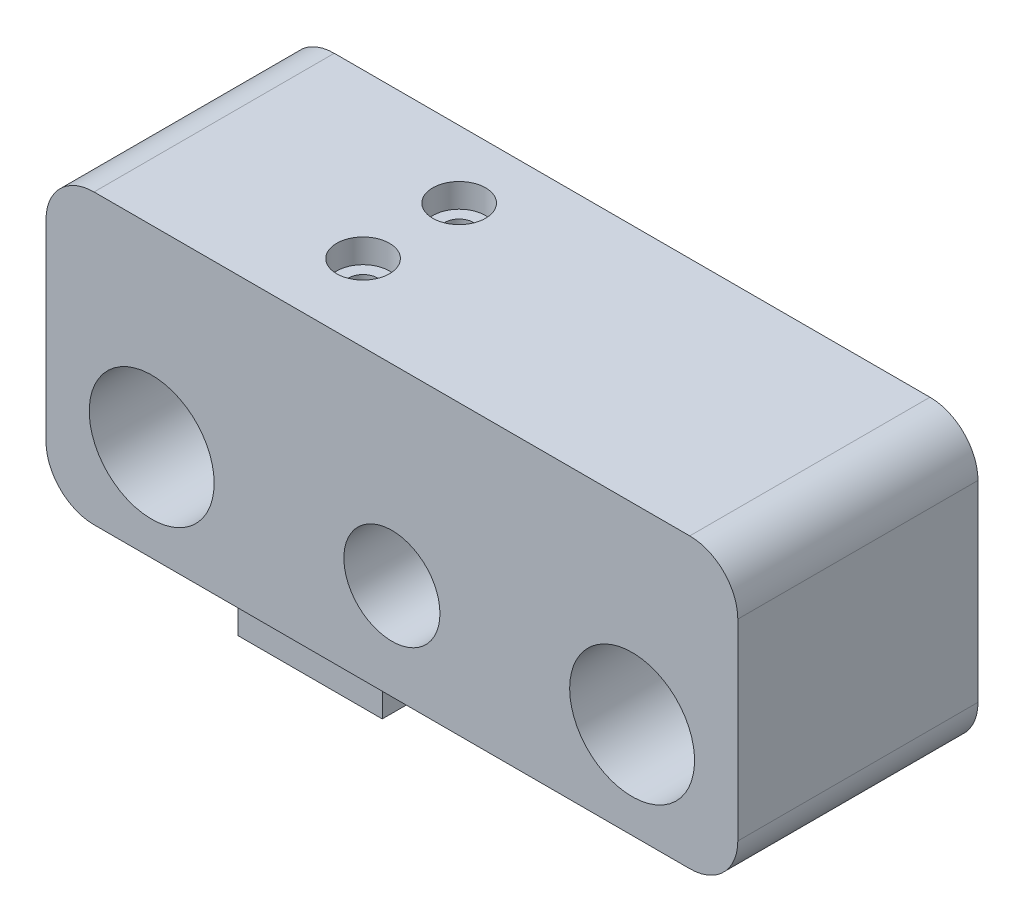
ISO-10303-21;
HEADER;
FILE_DESCRIPTION(('STEP AP214'),'2;1');
FILE_NAME('part.step','',(''),(''),'','','');
FILE_SCHEMA(('AUTOMOTIVE_DESIGN { 1 0 10303 214 1 1 1 1 }'));
ENDSEC;
DATA;
#1=APPLICATION_CONTEXT('core data for automotive mechanical design processes');
#2=APPLICATION_PROTOCOL_DEFINITION('international standard','automotive_design',2000,#1);
#3=PRODUCT_CONTEXT('',#1,'mechanical');
#4=PRODUCT('Part','Part','',(#3));
#5=PRODUCT_RELATED_PRODUCT_CATEGORY('part','',(#4));
#6=PRODUCT_DEFINITION_FORMATION('','',#4);
#7=PRODUCT_DEFINITION_CONTEXT('part definition',#1,'design');
#8=PRODUCT_DEFINITION('design','',#6,#7);
#9=PRODUCT_DEFINITION_SHAPE('','',#8);
#10=(LENGTH_UNIT() NAMED_UNIT(*) SI_UNIT(.MILLI.,.METRE.));
#11=(NAMED_UNIT(*) PLANE_ANGLE_UNIT() SI_UNIT($,.RADIAN.));
#12=(NAMED_UNIT(*) SI_UNIT($,.STERADIAN.) SOLID_ANGLE_UNIT());
#13=UNCERTAINTY_MEASURE_WITH_UNIT(LENGTH_MEASURE(1.E-05),#10,'distance_accuracy_value','');
#14=(GEOMETRIC_REPRESENTATION_CONTEXT(3) GLOBAL_UNCERTAINTY_ASSIGNED_CONTEXT((#13)) GLOBAL_UNIT_ASSIGNED_CONTEXT((#10,
#11,#12)) REPRESENTATION_CONTEXT('',''));
#15=CARTESIAN_POINT('',(0.,0.,0.));
#16=DIRECTION('',(0.,0.,1.));
#17=DIRECTION('',(1.,0.,0.));
#18=AXIS2_PLACEMENT_3D('',#15,#16,#17);
#19=CARTESIAN_POINT('',(-72.,-20.,-0.001000000000001));
#20=DIRECTION('',(0.,1.,0.));
#21=DIRECTION('',(0.,0.,1.));
#22=AXIS2_PLACEMENT_3D('',#19,#20,#21);
#23=PLANE('',#22);
#24=DIRECTION('',(-1.,0.,0.));
#25=VECTOR('',#24,1.);
#26=CARTESIAN_POINT('',(-72.,-20.,50.));
#27=LINE('',#26,#25);
#28=CARTESIAN_POINT('',(62.,-20.,50.));
#29=VERTEX_POINT('',#28);
#30=CARTESIAN_POINT('',(-62.,-20.,50.));
#31=VERTEX_POINT('',#30);
#32=EDGE_CURVE('E165',#29,#31,#27,.T.);
#33=ORIENTED_EDGE('',*,*,#32,.T.);
#34=DIRECTION('',(0.,0.,1.));
#35=VECTOR('',#34,1.);
#36=CARTESIAN_POINT('',(-62.,-20.,-0.001000000000001));
#37=LINE('',#36,#35);
#38=CARTESIAN_POINT('',(-62.,-20.,0.));
#39=VERTEX_POINT('',#38);
#40=EDGE_CURVE('E237',#31,#39,#37,.F.);
#41=ORIENTED_EDGE('',*,*,#40,.T.);
#42=DIRECTION('',(-1.,0.,0.));
#43=VECTOR('',#42,1.);
#44=CARTESIAN_POINT('',(-72.,-20.,0.));
#45=LINE('',#44,#43);
#46=CARTESIAN_POINT('',(62.,-20.,0.));
#47=VERTEX_POINT('',#46);
#48=EDGE_CURVE('E162',#47,#39,#45,.T.);
#49=ORIENTED_EDGE('',*,*,#48,.F.);
#50=DIRECTION('',(0.,0.,1.));
#51=VECTOR('',#50,1.);
#52=CARTESIAN_POINT('',(62.,-20.,-0.001000000000001));
#53=LINE('',#52,#51);
#54=EDGE_CURVE('E197',#47,#29,#53,.T.);
#55=ORIENTED_EDGE('',*,*,#54,.T.);
#56=EDGE_LOOP('',(#33,#41,#49,#55));
#57=FACE_BOUND('',#56,.T.);
#58=DIRECTION('',(0.,0.,-1.));
#59=VECTOR('',#58,1.);
#60=CARTESIAN_POINT('',(-37.,-20.,4.99999999999998));
#61=LINE('',#60,#59);
#62=CARTESIAN_POINT('',(-37.,-20.,45.));
#63=VERTEX_POINT('',#62);
#64=CARTESIAN_POINT('',(-37.,-20.,4.99999999999998));
#65=VERTEX_POINT('',#64);
#66=EDGE_CURVE('E143',#63,#65,#61,.T.);
#67=ORIENTED_EDGE('',*,*,#66,.F.);
#68=DIRECTION('',(-1.,0.,0.));
#69=VECTOR('',#68,1.);
#70=CARTESIAN_POINT('',(-6.99999999999998,-20.,45.));
#71=LINE('',#70,#69);
#72=CARTESIAN_POINT('',(-6.99999999999998,-20.,45.));
#73=VERTEX_POINT('',#72);
#74=EDGE_CURVE('E140',#73,#63,#71,.T.);
#75=ORIENTED_EDGE('',*,*,#74,.F.);
#76=DIRECTION('',(0.,0.,1.));
#77=VECTOR('',#76,1.);
#78=CARTESIAN_POINT('',(-6.99999999999998,-20.,4.99999999999998));
#79=LINE('',#78,#77);
#80=CARTESIAN_POINT('',(-6.99999999999998,-20.,4.99999999999998));
#81=VERTEX_POINT('',#80);
#82=EDGE_CURVE('E55',#81,#73,#79,.T.);
#83=ORIENTED_EDGE('',*,*,#82,.F.);
#84=DIRECTION('',(1.,0.,0.));
#85=VECTOR('',#84,1.);
#86=CARTESIAN_POINT('',(-6.99999999999998,-20.,4.99999999999998));
#87=LINE('',#86,#85);
#88=EDGE_CURVE('E50',#65,#81,#87,.T.);
#89=ORIENTED_EDGE('',*,*,#88,.F.);
#90=EDGE_LOOP('',(#67,#75,#83,#89));
#91=FACE_BOUND('',#90,.T.);
#92=ADVANCED_FACE('F33',(#57,#91),#23,.F.);
#93=CARTESIAN_POINT('',(-22.,80.,14.));
#94=DIRECTION('',(0.,-1.,0.));
#95=DIRECTION('',(0.,0.,-1.));
#96=AXIS2_PLACEMENT_3D('',#93,#94,#95);
#97=CYLINDRICAL_SURFACE('',#96,3.);
#98=CARTESIAN_POINT('',(-22.,35.,14.));
#99=DIRECTION('',(0.,1.,0.));
#100=DIRECTION('',(0.,0.,1.));
#101=AXIS2_PLACEMENT_3D('',#98,#99,#100);
#102=CIRCLE('',#101,3.);
#103=CARTESIAN_POINT('',(-22.,35.,17.));
#104=VERTEX_POINT('',#103);
#105=EDGE_CURVE('E37',#104,#104,#102,.F.);
#106=ORIENTED_EDGE('',*,*,#105,.F.);
#107=EDGE_LOOP('',(#106));
#108=FACE_BOUND('',#107,.T.);
#109=CARTESIAN_POINT('',(-22.,-30.,14.));
#110=DIRECTION('',(0.,-1.,0.));
#111=DIRECTION('',(0.,0.,-1.));
#112=AXIS2_PLACEMENT_3D('',#109,#110,#111);
#113=CIRCLE('',#112,3.);
#114=CARTESIAN_POINT('',(-22.,-30.,11.));
#115=VERTEX_POINT('',#114);
#116=EDGE_CURVE('E255',#115,#115,#113,.F.);
#117=ORIENTED_EDGE('',*,*,#116,.F.);
#118=EDGE_LOOP('',(#117));
#119=FACE_BOUND('',#118,.T.);
#120=ADVANCED_FACE('F248',(#108,#119),#97,.F.);
#121=CARTESIAN_POINT('',(-22.,80.,34.));
#122=DIRECTION('',(0.,-1.,0.));
#123=DIRECTION('',(0.,0.,-1.));
#124=AXIS2_PLACEMENT_3D('',#121,#122,#123);
#125=CYLINDRICAL_SURFACE('',#124,3.);
#126=CARTESIAN_POINT('',(-22.,35.,34.));
#127=DIRECTION('',(0.,1.,0.));
#128=DIRECTION('',(0.,0.,1.));
#129=AXIS2_PLACEMENT_3D('',#126,#127,#128);
#130=CIRCLE('',#129,3.);
#131=CARTESIAN_POINT('',(-22.,35.,37.));
#132=VERTEX_POINT('',#131);
#133=EDGE_CURVE('E156',#132,#132,#130,.F.);
#134=ORIENTED_EDGE('',*,*,#133,.F.);
#135=EDGE_LOOP('',(#134));
#136=FACE_BOUND('',#135,.T.);
#137=CARTESIAN_POINT('',(-22.,-30.,34.));
#138=DIRECTION('',(0.,-1.,0.));
#139=DIRECTION('',(0.,0.,-1.));
#140=AXIS2_PLACEMENT_3D('',#137,#138,#139);
#141=CIRCLE('',#140,3.);
#142=CARTESIAN_POINT('',(-22.,-30.,31.));
#143=VERTEX_POINT('',#142);
#144=EDGE_CURVE('E257',#143,#143,#141,.F.);
#145=ORIENTED_EDGE('',*,*,#144,.F.);
#146=EDGE_LOOP('',(#145));
#147=FACE_BOUND('',#146,.T.);
#148=ADVANCED_FACE('F251',(#136,#147),#125,.F.);
#149=CARTESIAN_POINT('',(-62.,-10.,50.));
#150=DIRECTION('',(0.,0.,1.));
#151=DIRECTION('',(1.,0.,0.));
#152=AXIS2_PLACEMENT_3D('',#149,#150,#151);
#153=CYLINDRICAL_SURFACE('',#152,10.);
#154=DIRECTION('',(0.,0.,1.));
#155=VECTOR('',#154,1.);
#156=CARTESIAN_POINT('',(-72.,-10.,50.));
#157=LINE('',#156,#155);
#158=CARTESIAN_POINT('',(-72.,-10.,0.));
#159=VERTEX_POINT('',#158);
#160=CARTESIAN_POINT('',(-72.,-10.,50.));
#161=VERTEX_POINT('',#160);
#162=EDGE_CURVE('E234',#159,#161,#157,.T.);
#163=ORIENTED_EDGE('',*,*,#162,.F.);
#164=CARTESIAN_POINT('',(-62.,-10.,0.));
#165=DIRECTION('',(0.,0.,-1.));
#166=DIRECTION('',(-1.,0.,0.));
#167=AXIS2_PLACEMENT_3D('',#164,#165,#166);
#168=CIRCLE('',#167,10.);
#169=EDGE_CURVE('E42',#39,#159,#168,.T.);
#170=ORIENTED_EDGE('',*,*,#169,.F.);
#171=ORIENTED_EDGE('',*,*,#40,.F.);
#172=CARTESIAN_POINT('',(-62.,-10.,50.));
#173=DIRECTION('',(0.,0.,-1.));
#174=DIRECTION('',(-1.,0.,0.));
#175=AXIS2_PLACEMENT_3D('',#172,#173,#174);
#176=CIRCLE('',#175,10.);
#177=EDGE_CURVE('E11',#161,#31,#176,.F.);
#178=ORIENTED_EDGE('',*,*,#177,.F.);
#179=EDGE_LOOP('',(#163,#170,#171,#178));
#180=FACE_BOUND('',#179,.T.);
#181=ADVANCED_FACE('F35',(#180),#153,.T.);
#182=CARTESIAN_POINT('',(-62.,30.,50.));
#183=DIRECTION('',(0.,0.,1.));
#184=DIRECTION('',(1.,0.,0.));
#185=AXIS2_PLACEMENT_3D('',#182,#183,#184);
#186=CYLINDRICAL_SURFACE('',#185,10.);
#187=DIRECTION('',(0.,0.,1.));
#188=VECTOR('',#187,1.);
#189=CARTESIAN_POINT('',(-62.,40.,50.));
#190=LINE('',#189,#188);
#191=CARTESIAN_POINT('',(-62.,40.,0.));
#192=VERTEX_POINT('',#191);
#193=CARTESIAN_POINT('',(-62.,40.,50.));
#194=VERTEX_POINT('',#193);
#195=EDGE_CURVE('E224',#192,#194,#190,.T.);
#196=ORIENTED_EDGE('',*,*,#195,.F.);
#197=CARTESIAN_POINT('',(-62.,30.,0.));
#198=DIRECTION('',(0.,0.,-1.));
#199=DIRECTION('',(-1.,0.,0.));
#200=AXIS2_PLACEMENT_3D('',#197,#198,#199);
#201=CIRCLE('',#200,10.);
#202=CARTESIAN_POINT('',(-72.,30.,0.));
#203=VERTEX_POINT('',#202);
#204=EDGE_CURVE('E230',#203,#192,#201,.T.);
#205=ORIENTED_EDGE('',*,*,#204,.F.);
#206=DIRECTION('',(0.,0.,1.));
#207=VECTOR('',#206,1.);
#208=CARTESIAN_POINT('',(-72.,30.,50.));
#209=LINE('',#208,#207);
#210=CARTESIAN_POINT('',(-72.,30.,50.));
#211=VERTEX_POINT('',#210);
#212=EDGE_CURVE('E227',#211,#203,#209,.F.);
#213=ORIENTED_EDGE('',*,*,#212,.F.);
#214=CARTESIAN_POINT('',(-62.,30.,50.));
#215=DIRECTION('',(0.,0.,-1.));
#216=DIRECTION('',(-1.,0.,0.));
#217=AXIS2_PLACEMENT_3D('',#214,#215,#216);
#218=CIRCLE('',#217,10.);
#219=EDGE_CURVE('E232',#194,#211,#218,.F.);
#220=ORIENTED_EDGE('',*,*,#219,.F.);
#221=EDGE_LOOP('',(#196,#205,#213,#220));
#222=FACE_BOUND('',#221,.T.);
#223=ADVANCED_FACE('F330',(#222),#186,.T.);
#224=CARTESIAN_POINT('',(62.,30.,50.));
#225=DIRECTION('',(0.,0.,1.));
#226=DIRECTION('',(1.,0.,0.));
#227=AXIS2_PLACEMENT_3D('',#224,#225,#226);
#228=CYLINDRICAL_SURFACE('',#227,10.);
#229=DIRECTION('',(0.,0.,1.));
#230=VECTOR('',#229,1.);
#231=CARTESIAN_POINT('',(72.,30.,50.));
#232=LINE('',#231,#230);
#233=CARTESIAN_POINT('',(72.,30.,0.));
#234=VERTEX_POINT('',#233);
#235=CARTESIAN_POINT('',(72.,30.,50.));
#236=VERTEX_POINT('',#235);
#237=EDGE_CURVE('E214',#234,#236,#232,.T.);
#238=ORIENTED_EDGE('',*,*,#237,.F.);
#239=CARTESIAN_POINT('',(62.,30.,0.));
#240=DIRECTION('',(0.,0.,-1.));
#241=DIRECTION('',(-1.,0.,0.));
#242=AXIS2_PLACEMENT_3D('',#239,#240,#241);
#243=CIRCLE('',#242,10.);
#244=CARTESIAN_POINT('',(62.,40.,0.));
#245=VERTEX_POINT('',#244);
#246=EDGE_CURVE('E220',#245,#234,#243,.T.);
#247=ORIENTED_EDGE('',*,*,#246,.F.);
#248=DIRECTION('',(0.,0.,1.));
#249=VECTOR('',#248,1.);
#250=CARTESIAN_POINT('',(62.,40.,50.));
#251=LINE('',#250,#249);
#252=CARTESIAN_POINT('',(62.,40.,50.));
#253=VERTEX_POINT('',#252);
#254=EDGE_CURVE('E217',#253,#245,#251,.F.);
#255=ORIENTED_EDGE('',*,*,#254,.F.);
#256=CARTESIAN_POINT('',(62.,30.,50.));
#257=DIRECTION('',(0.,0.,-1.));
#258=DIRECTION('',(-1.,0.,0.));
#259=AXIS2_PLACEMENT_3D('',#256,#257,#258);
#260=CIRCLE('',#259,10.);
#261=EDGE_CURVE('E222',#236,#253,#260,.F.);
#262=ORIENTED_EDGE('',*,*,#261,.F.);
#263=EDGE_LOOP('',(#238,#247,#255,#262));
#264=FACE_BOUND('',#263,.T.);
#265=ADVANCED_FACE('F327',(#264),#228,.T.);
#266=CARTESIAN_POINT('',(62.,-10.,-0.001000000000001));
#267=DIRECTION('',(0.,0.,1.));
#268=DIRECTION('',(1.,0.,0.));
#269=AXIS2_PLACEMENT_3D('',#266,#267,#268);
#270=CYLINDRICAL_SURFACE('',#269,10.);
#271=ORIENTED_EDGE('',*,*,#54,.F.);
#272=CARTESIAN_POINT('',(62.,-10.,0.));
#273=DIRECTION('',(0.,0.,-1.));
#274=DIRECTION('',(-1.,0.,0.));
#275=AXIS2_PLACEMENT_3D('',#272,#273,#274);
#276=CIRCLE('',#275,10.);
#277=CARTESIAN_POINT('',(72.,-10.,0.));
#278=VERTEX_POINT('',#277);
#279=EDGE_CURVE('E210',#278,#47,#276,.T.);
#280=ORIENTED_EDGE('',*,*,#279,.F.);
#281=DIRECTION('',(0.,0.,1.));
#282=VECTOR('',#281,1.);
#283=CARTESIAN_POINT('',(72.,-10.,50.));
#284=LINE('',#283,#282);
#285=CARTESIAN_POINT('',(72.,-10.,50.));
#286=VERTEX_POINT('',#285);
#287=EDGE_CURVE('E207',#286,#278,#284,.F.);
#288=ORIENTED_EDGE('',*,*,#287,.F.);
#289=CARTESIAN_POINT('',(62.,-10.,50.));
#290=DIRECTION('',(0.,0.,-1.));
#291=DIRECTION('',(-1.,0.,0.));
#292=AXIS2_PLACEMENT_3D('',#289,#290,#291);
#293=CIRCLE('',#292,10.);
#294=EDGE_CURVE('E212',#29,#286,#293,.F.);
#295=ORIENTED_EDGE('',*,*,#294,.F.);
#296=EDGE_LOOP('',(#271,#280,#288,#295));
#297=FACE_BOUND('',#296,.T.);
#298=ADVANCED_FACE('F323',(#297),#270,.T.);
#299=CARTESIAN_POINT('',(72.,-40.,50.));
#300=DIRECTION('',(-1.,0.,0.));
#301=DIRECTION('',(0.,0.,1.));
#302=AXIS2_PLACEMENT_3D('',#299,#300,#301);
#303=PLANE('',#302);
#304=DIRECTION('',(0.,1.,0.));
#305=VECTOR('',#304,1.);
#306=CARTESIAN_POINT('',(72.,-40.,0.));
#307=LINE('',#306,#305);
#308=EDGE_CURVE('E184',#278,#234,#307,.T.);
#309=ORIENTED_EDGE('',*,*,#308,.T.);
#310=ORIENTED_EDGE('',*,*,#237,.T.);
#311=DIRECTION('',(0.,1.,0.));
#312=VECTOR('',#311,1.);
#313=CARTESIAN_POINT('',(72.,-40.,50.));
#314=LINE('',#313,#312);
#315=EDGE_CURVE('E187',#286,#236,#314,.T.);
#316=ORIENTED_EDGE('',*,*,#315,.F.);
#317=ORIENTED_EDGE('',*,*,#287,.T.);
#318=EDGE_LOOP('',(#309,#310,#316,#317));
#319=FACE_BOUND('',#318,.T.);
#320=ADVANCED_FACE('F319',(#319),#303,.F.);
#321=CARTESIAN_POINT('',(-72.,40.,50.));
#322=DIRECTION('',(0.,-1.,0.));
#323=DIRECTION('',(0.,0.,-1.));
#324=AXIS2_PLACEMENT_3D('',#321,#322,#323);
#325=PLANE('',#324);
#326=CARTESIAN_POINT('',(-22.,40.,14.));
#327=DIRECTION('',(0.,1.,0.));
#328=DIRECTION('',(0.,0.,1.));
#329=AXIS2_PLACEMENT_3D('',#326,#327,#328);
#330=CIRCLE('',#329,5.5);
#331=CARTESIAN_POINT('',(-22.,40.,19.5));
#332=VERTEX_POINT('',#331);
#333=EDGE_CURVE('E157',#332,#332,#330,.T.);
#334=ORIENTED_EDGE('',*,*,#333,.F.);
#335=EDGE_LOOP('',(#334));
#336=FACE_BOUND('',#335,.T.);
#337=CARTESIAN_POINT('',(-22.,40.,34.));
#338=DIRECTION('',(0.,1.,0.));
#339=DIRECTION('',(0.,0.,1.));
#340=AXIS2_PLACEMENT_3D('',#337,#338,#339);
#341=CIRCLE('',#340,5.5);
#342=CARTESIAN_POINT('',(-22.,40.,39.5));
#343=VERTEX_POINT('',#342);
#344=EDGE_CURVE('E144',#343,#343,#341,.T.);
#345=ORIENTED_EDGE('',*,*,#344,.F.);
#346=EDGE_LOOP('',(#345));
#347=FACE_BOUND('',#346,.T.);
#348=DIRECTION('',(-1.,0.,0.));
#349=VECTOR('',#348,1.);
#350=CARTESIAN_POINT('',(-72.,40.,0.));
#351=LINE('',#350,#349);
#352=EDGE_CURVE('E200',#245,#192,#351,.T.);
#353=ORIENTED_EDGE('',*,*,#352,.T.);
#354=ORIENTED_EDGE('',*,*,#195,.T.);
#355=DIRECTION('',(-1.,0.,0.));
#356=VECTOR('',#355,1.);
#357=CARTESIAN_POINT('',(-72.,40.,50.));
#358=LINE('',#357,#356);
#359=EDGE_CURVE('E190',#253,#194,#358,.T.);
#360=ORIENTED_EDGE('',*,*,#359,.F.);
#361=ORIENTED_EDGE('',*,*,#254,.T.);
#362=EDGE_LOOP('',(#353,#354,#360,#361));
#363=FACE_BOUND('',#362,.T.);
#364=ADVANCED_FACE('F315',(#336,#347,#363),#325,.F.);
#365=CARTESIAN_POINT('',(-72.,-40.,50.));
#366=DIRECTION('',(1.,0.,0.));
#367=DIRECTION('',(0.,0.,-1.));
#368=AXIS2_PLACEMENT_3D('',#365,#366,#367);
#369=PLANE('',#368);
#370=DIRECTION('',(0.,-1.,0.));
#371=VECTOR('',#370,1.);
#372=CARTESIAN_POINT('',(-72.,-40.,0.));
#373=LINE('',#372,#371);
#374=EDGE_CURVE('E191',#203,#159,#373,.T.);
#375=ORIENTED_EDGE('',*,*,#374,.T.);
#376=ORIENTED_EDGE('',*,*,#162,.T.);
#377=DIRECTION('',(0.,-1.,0.));
#378=VECTOR('',#377,1.);
#379=CARTESIAN_POINT('',(-72.,-40.,50.));
#380=LINE('',#379,#378);
#381=EDGE_CURVE('E194',#211,#161,#380,.T.);
#382=ORIENTED_EDGE('',*,*,#381,.F.);
#383=ORIENTED_EDGE('',*,*,#212,.T.);
#384=EDGE_LOOP('',(#375,#376,#382,#383));
#385=FACE_BOUND('',#384,.T.);
#386=ADVANCED_FACE('F308',(#385),#369,.F.);
#387=CARTESIAN_POINT('',(0.,0.,50.));
#388=DIRECTION('',(0.,0.,-1.));
#389=DIRECTION('',(-1.,0.,0.));
#390=AXIS2_PLACEMENT_3D('',#387,#388,#389);
#391=PLANE('',#390);
#392=CARTESIAN_POINT('',(50.,0.,50.));
#393=DIRECTION('',(0.,0.,1.));
#394=DIRECTION('',(-1.,0.,0.));
#395=AXIS2_PLACEMENT_3D('',#392,#393,#394);
#396=CIRCLE('',#395,13.);
#397=CARTESIAN_POINT('',(37.,0.,50.));
#398=VERTEX_POINT('',#397);
#399=EDGE_CURVE('E176',#398,#398,#396,.T.);
#400=ORIENTED_EDGE('',*,*,#399,.F.);
#401=EDGE_LOOP('',(#400));
#402=FACE_BOUND('',#401,.T.);
#403=CARTESIAN_POINT('',(-50.,0.,50.));
#404=DIRECTION('',(0.,0.,1.));
#405=DIRECTION('',(1.,0.,0.));
#406=AXIS2_PLACEMENT_3D('',#403,#404,#405);
#407=CIRCLE('',#406,13.);
#408=CARTESIAN_POINT('',(-37.,0.,50.));
#409=VERTEX_POINT('',#408);
#410=EDGE_CURVE('E169',#409,#409,#407,.T.);
#411=ORIENTED_EDGE('',*,*,#410,.F.);
#412=EDGE_LOOP('',(#411));
#413=FACE_BOUND('',#412,.T.);
#414=CARTESIAN_POINT('',(0.,0.,50.));
#415=DIRECTION('',(0.,0.,1.));
#416=DIRECTION('',(1.,0.,0.));
#417=AXIS2_PLACEMENT_3D('',#414,#415,#416);
#418=CIRCLE('',#417,10.);
#419=CARTESIAN_POINT('',(10.,0.,50.));
#420=VERTEX_POINT('',#419);
#421=EDGE_CURVE('E181',#420,#420,#418,.T.);
#422=ORIENTED_EDGE('',*,*,#421,.F.);
#423=EDGE_LOOP('',(#422));
#424=FACE_BOUND('',#423,.T.);
#425=ORIENTED_EDGE('',*,*,#381,.T.);
#426=ORIENTED_EDGE('',*,*,#177,.T.);
#427=ORIENTED_EDGE('',*,*,#32,.F.);
#428=ORIENTED_EDGE('',*,*,#294,.T.);
#429=ORIENTED_EDGE('',*,*,#315,.T.);
#430=ORIENTED_EDGE('',*,*,#261,.T.);
#431=ORIENTED_EDGE('',*,*,#359,.T.);
#432=ORIENTED_EDGE('',*,*,#219,.T.);
#433=EDGE_LOOP('',(#425,#426,#427,#428,#429,#430,#431,#432));
#434=FACE_BOUND('',#433,.T.);
#435=ADVANCED_FACE('F305',(#402,#413,#424,#434),#391,.F.);
#436=CARTESIAN_POINT('',(0.,0.,0.));
#437=DIRECTION('',(0.,0.,-1.));
#438=DIRECTION('',(-1.,0.,0.));
#439=AXIS2_PLACEMENT_3D('',#436,#437,#438);
#440=PLANE('',#439);
#441=ORIENTED_EDGE('',*,*,#48,.T.);
#442=ORIENTED_EDGE('',*,*,#169,.T.);
#443=ORIENTED_EDGE('',*,*,#374,.F.);
#444=ORIENTED_EDGE('',*,*,#204,.T.);
#445=ORIENTED_EDGE('',*,*,#352,.F.);
#446=ORIENTED_EDGE('',*,*,#246,.T.);
#447=ORIENTED_EDGE('',*,*,#308,.F.);
#448=ORIENTED_EDGE('',*,*,#279,.T.);
#449=EDGE_LOOP('',(#441,#442,#443,#444,#445,#446,#447,#448));
#450=FACE_BOUND('',#449,.T.);
#451=CARTESIAN_POINT('',(50.,0.,0.));
#452=DIRECTION('',(0.,0.,-1.));
#453=DIRECTION('',(-1.,0.,0.));
#454=AXIS2_PLACEMENT_3D('',#451,#452,#453);
#455=CIRCLE('',#454,13.);
#456=CARTESIAN_POINT('',(37.,0.,0.));
#457=VERTEX_POINT('',#456);
#458=EDGE_CURVE('E168',#457,#457,#455,.F.);
#459=ORIENTED_EDGE('',*,*,#458,.T.);
#460=EDGE_LOOP('',(#459));
#461=FACE_BOUND('',#460,.T.);
#462=CARTESIAN_POINT('',(-50.,0.,0.));
#463=DIRECTION('',(0.,0.,-1.));
#464=DIRECTION('',(-1.,0.,0.));
#465=AXIS2_PLACEMENT_3D('',#462,#463,#464);
#466=CIRCLE('',#465,13.);
#467=CARTESIAN_POINT('',(-63.,0.,0.));
#468=VERTEX_POINT('',#467);
#469=EDGE_CURVE('E173',#468,#468,#466,.F.);
#470=ORIENTED_EDGE('',*,*,#469,.T.);
#471=EDGE_LOOP('',(#470));
#472=FACE_BOUND('',#471,.T.);
#473=CARTESIAN_POINT('',(0.,0.,0.));
#474=DIRECTION('',(0.,0.,-1.));
#475=DIRECTION('',(-1.,0.,0.));
#476=AXIS2_PLACEMENT_3D('',#473,#474,#475);
#477=CIRCLE('',#476,10.);
#478=CARTESIAN_POINT('',(-10.,0.,0.));
#479=VERTEX_POINT('',#478);
#480=EDGE_CURVE('E172',#479,#479,#477,.F.);
#481=ORIENTED_EDGE('',*,*,#480,.T.);
#482=EDGE_LOOP('',(#481));
#483=FACE_BOUND('',#482,.T.);
#484=ADVANCED_FACE('F303',(#450,#461,#472,#483),#440,.T.);
#485=CARTESIAN_POINT('',(0.,0.,-0.001000000000001));
#486=DIRECTION('',(0.,0.,1.));
#487=DIRECTION('',(1.,0.,0.));
#488=AXIS2_PLACEMENT_3D('',#485,#486,#487);
#489=CYLINDRICAL_SURFACE('',#488,10.);
#490=ORIENTED_EDGE('',*,*,#480,.F.);
#491=EDGE_LOOP('',(#490));
#492=FACE_BOUND('',#491,.T.);
#493=ORIENTED_EDGE('',*,*,#421,.T.);
#494=EDGE_LOOP('',(#493));
#495=FACE_BOUND('',#494,.T.);
#496=ADVANCED_FACE('F295',(#492,#495),#489,.F.);
#497=CARTESIAN_POINT('',(-50.,0.,-0.001000000000001));
#498=DIRECTION('',(0.,0.,1.));
#499=DIRECTION('',(1.,0.,0.));
#500=AXIS2_PLACEMENT_3D('',#497,#498,#499);
#501=CYLINDRICAL_SURFACE('',#500,13.);
#502=ORIENTED_EDGE('',*,*,#469,.F.);
#503=EDGE_LOOP('',(#502));
#504=FACE_BOUND('',#503,.T.);
#505=ORIENTED_EDGE('',*,*,#410,.T.);
#506=EDGE_LOOP('',(#505));
#507=FACE_BOUND('',#506,.T.);
#508=ADVANCED_FACE('F291',(#504,#507),#501,.F.);
#509=CARTESIAN_POINT('',(50.,0.,-0.001000000000001));
#510=DIRECTION('',(0.,0.,1.));
#511=DIRECTION('',(1.,0.,0.));
#512=AXIS2_PLACEMENT_3D('',#509,#510,#511);
#513=CYLINDRICAL_SURFACE('',#512,13.);
#514=ORIENTED_EDGE('',*,*,#458,.F.);
#515=EDGE_LOOP('',(#514));
#516=FACE_BOUND('',#515,.T.);
#517=ORIENTED_EDGE('',*,*,#399,.T.);
#518=EDGE_LOOP('',(#517));
#519=FACE_BOUND('',#518,.T.);
#520=ADVANCED_FACE('F294',(#516,#519),#513,.F.);
#521=CARTESIAN_POINT('',(-22.,35.,34.));
#522=DIRECTION('',(0.,1.,0.));
#523=DIRECTION('',(0.,0.,1.));
#524=AXIS2_PLACEMENT_3D('',#521,#522,#523);
#525=PLANE('',#524);
#526=CARTESIAN_POINT('',(-22.,35.,34.));
#527=DIRECTION('',(0.,1.,0.));
#528=DIRECTION('',(0.,0.,1.));
#529=AXIS2_PLACEMENT_3D('',#526,#527,#528);
#530=CIRCLE('',#529,5.5);
#531=CARTESIAN_POINT('',(-22.,35.,39.5));
#532=VERTEX_POINT('',#531);
#533=EDGE_CURVE('E147',#532,#532,#530,.T.);
#534=ORIENTED_EDGE('',*,*,#533,.T.);
#535=EDGE_LOOP('',(#534));
#536=FACE_BOUND('',#535,.T.);
#537=ORIENTED_EDGE('',*,*,#133,.T.);
#538=EDGE_LOOP('',(#537));
#539=FACE_BOUND('',#538,.T.);
#540=ADVANCED_FACE('F299',(#536,#539),#525,.T.);
#541=CARTESIAN_POINT('',(-22.,35.,34.));
#542=DIRECTION('',(0.,1.,0.));
#543=DIRECTION('',(0.,0.,1.));
#544=AXIS2_PLACEMENT_3D('',#541,#542,#543);
#545=CYLINDRICAL_SURFACE('',#544,5.5);
#546=ORIENTED_EDGE('',*,*,#533,.F.);
#547=EDGE_LOOP('',(#546));
#548=FACE_BOUND('',#547,.T.);
#549=ORIENTED_EDGE('',*,*,#344,.T.);
#550=EDGE_LOOP('',(#549));
#551=FACE_BOUND('',#550,.T.);
#552=ADVANCED_FACE('F378',(#548,#551),#545,.F.);
#553=CARTESIAN_POINT('',(-22.,35.,14.));
#554=DIRECTION('',(0.,1.,0.));
#555=DIRECTION('',(0.,0.,1.));
#556=AXIS2_PLACEMENT_3D('',#553,#554,#555);
#557=PLANE('',#556);
#558=CARTESIAN_POINT('',(-22.,35.,14.));
#559=DIRECTION('',(0.,1.,0.));
#560=DIRECTION('',(0.,0.,1.));
#561=AXIS2_PLACEMENT_3D('',#558,#559,#560);
#562=CIRCLE('',#561,5.5);
#563=CARTESIAN_POINT('',(-22.,35.,19.5));
#564=VERTEX_POINT('',#563);
#565=EDGE_CURVE('E153',#564,#564,#562,.T.);
#566=ORIENTED_EDGE('',*,*,#565,.T.);
#567=EDGE_LOOP('',(#566));
#568=FACE_BOUND('',#567,.T.);
#569=ORIENTED_EDGE('',*,*,#105,.T.);
#570=EDGE_LOOP('',(#569));
#571=FACE_BOUND('',#570,.T.);
#572=ADVANCED_FACE('F246',(#568,#571),#557,.T.);
#573=CARTESIAN_POINT('',(-22.,35.,14.));
#574=DIRECTION('',(0.,1.,0.));
#575=DIRECTION('',(0.,0.,1.));
#576=AXIS2_PLACEMENT_3D('',#573,#574,#575);
#577=CYLINDRICAL_SURFACE('',#576,5.5);
#578=ORIENTED_EDGE('',*,*,#565,.F.);
#579=EDGE_LOOP('',(#578));
#580=FACE_BOUND('',#579,.T.);
#581=ORIENTED_EDGE('',*,*,#333,.T.);
#582=EDGE_LOOP('',(#581));
#583=FACE_BOUND('',#582,.T.);
#584=ADVANCED_FACE('F385',(#580,#583),#577,.F.);
#585=CARTESIAN_POINT('',(0.,-30.,0.));
#586=DIRECTION('',(0.,-1.,0.));
#587=DIRECTION('',(0.,0.,-1.));
#588=AXIS2_PLACEMENT_3D('',#585,#586,#587);
#589=PLANE('',#588);
#590=ORIENTED_EDGE('',*,*,#144,.T.);
#591=EDGE_LOOP('',(#590));
#592=FACE_BOUND('',#591,.T.);
#593=ORIENTED_EDGE('',*,*,#116,.T.);
#594=EDGE_LOOP('',(#593));
#595=FACE_BOUND('',#594,.T.);
#596=DIRECTION('',(0.,0.,-1.));
#597=VECTOR('',#596,1.);
#598=CARTESIAN_POINT('',(-37.,-30.,4.99999999999998));
#599=LINE('',#598,#597);
#600=CARTESIAN_POINT('',(-37.,-30.,45.));
#601=VERTEX_POINT('',#600);
#602=CARTESIAN_POINT('',(-37.,-30.,4.99999999999998));
#603=VERTEX_POINT('',#602);
#604=EDGE_CURVE('E131',#601,#603,#599,.T.);
#605=ORIENTED_EDGE('',*,*,#604,.T.);
#606=DIRECTION('',(1.,0.,0.));
#607=VECTOR('',#606,1.);
#608=CARTESIAN_POINT('',(-6.99999999999998,-30.,4.99999999999998));
#609=LINE('',#608,#607);
#610=CARTESIAN_POINT('',(-6.99999999999998,-30.,4.99999999999998));
#611=VERTEX_POINT('',#610);
#612=EDGE_CURVE('E120',#603,#611,#609,.T.);
#613=ORIENTED_EDGE('',*,*,#612,.T.);
#614=DIRECTION('',(0.,0.,1.));
#615=VECTOR('',#614,1.);
#616=CARTESIAN_POINT('',(-6.99999999999998,-30.,4.99999999999998));
#617=LINE('',#616,#615);
#618=CARTESIAN_POINT('',(-6.99999999999998,-30.,45.));
#619=VERTEX_POINT('',#618);
#620=EDGE_CURVE('E130',#611,#619,#617,.T.);
#621=ORIENTED_EDGE('',*,*,#620,.T.);
#622=DIRECTION('',(-1.,0.,0.));
#623=VECTOR('',#622,1.);
#624=CARTESIAN_POINT('',(-6.99999999999998,-30.,45.));
#625=LINE('',#624,#623);
#626=EDGE_CURVE('E136',#619,#601,#625,.T.);
#627=ORIENTED_EDGE('',*,*,#626,.T.);
#628=EDGE_LOOP('',(#605,#613,#621,#627));
#629=FACE_BOUND('',#628,.T.);
#630=ADVANCED_FACE('F134',(#592,#595,#629),#589,.T.);
#631=CARTESIAN_POINT('',(-6.99999999999998,-30.,45.));
#632=DIRECTION('',(0.,0.,-1.));
#633=DIRECTION('',(-1.,0.,0.));
#634=AXIS2_PLACEMENT_3D('',#631,#632,#633);
#635=PLANE('',#634);
#636=ORIENTED_EDGE('',*,*,#74,.T.);
#637=DIRECTION('',(0.,1.,0.));
#638=VECTOR('',#637,1.);
#639=CARTESIAN_POINT('',(-37.,-30.,45.));
#640=LINE('',#639,#638);
#641=EDGE_CURVE('E264',#601,#63,#640,.T.);
#642=ORIENTED_EDGE('',*,*,#641,.F.);
#643=ORIENTED_EDGE('',*,*,#626,.F.);
#644=DIRECTION('',(0.,1.,0.));
#645=VECTOR('',#644,1.);
#646=CARTESIAN_POINT('',(-6.99999999999998,-30.,45.));
#647=LINE('',#646,#645);
#648=EDGE_CURVE('E149',#619,#73,#647,.T.);
#649=ORIENTED_EDGE('',*,*,#648,.T.);
#650=EDGE_LOOP('',(#636,#642,#643,#649));
#651=FACE_BOUND('',#650,.T.);
#652=ADVANCED_FACE('F273',(#651),#635,.F.);
#653=CARTESIAN_POINT('',(-6.99999999999998,-30.,4.99999999999998));
#654=DIRECTION('',(-1.,0.,0.));
#655=DIRECTION('',(0.,0.,1.));
#656=AXIS2_PLACEMENT_3D('',#653,#654,#655);
#657=PLANE('',#656);
#658=ORIENTED_EDGE('',*,*,#82,.T.);
#659=ORIENTED_EDGE('',*,*,#648,.F.);
#660=ORIENTED_EDGE('',*,*,#620,.F.);
#661=DIRECTION('',(0.,1.,0.));
#662=VECTOR('',#661,1.);
#663=CARTESIAN_POINT('',(-6.99999999999998,-30.,4.99999999999998));
#664=LINE('',#663,#662);
#665=EDGE_CURVE('E127',#611,#81,#664,.T.);
#666=ORIENTED_EDGE('',*,*,#665,.T.);
#667=EDGE_LOOP('',(#658,#659,#660,#666));
#668=FACE_BOUND('',#667,.T.);
#669=ADVANCED_FACE('F275',(#668),#657,.F.);
#670=CARTESIAN_POINT('',(-6.99999999999998,-30.,4.99999999999998));
#671=DIRECTION('',(0.,0.,1.));
#672=DIRECTION('',(1.,0.,0.));
#673=AXIS2_PLACEMENT_3D('',#670,#671,#672);
#674=PLANE('',#673);
#675=ORIENTED_EDGE('',*,*,#88,.T.);
#676=ORIENTED_EDGE('',*,*,#665,.F.);
#677=ORIENTED_EDGE('',*,*,#612,.F.);
#678=DIRECTION('',(0.,1.,0.));
#679=VECTOR('',#678,1.);
#680=CARTESIAN_POINT('',(-37.,-30.,4.99999999999998));
#681=LINE('',#680,#679);
#682=EDGE_CURVE('E124',#603,#65,#681,.T.);
#683=ORIENTED_EDGE('',*,*,#682,.T.);
#684=EDGE_LOOP('',(#675,#676,#677,#683));
#685=FACE_BOUND('',#684,.T.);
#686=ADVANCED_FACE('F122',(#685),#674,.F.);
#687=CARTESIAN_POINT('',(-37.,-30.,4.99999999999998));
#688=DIRECTION('',(1.,0.,0.));
#689=DIRECTION('',(0.,0.,-1.));
#690=AXIS2_PLACEMENT_3D('',#687,#688,#689);
#691=PLANE('',#690);
#692=ORIENTED_EDGE('',*,*,#66,.T.);
#693=ORIENTED_EDGE('',*,*,#682,.F.);
#694=ORIENTED_EDGE('',*,*,#604,.F.);
#695=ORIENTED_EDGE('',*,*,#641,.T.);
#696=EDGE_LOOP('',(#692,#693,#694,#695));
#697=FACE_BOUND('',#696,.T.);
#698=ADVANCED_FACE('F142',(#697),#691,.F.);
#699=CLOSED_SHELL('',(#92,#120,#148,#181,#223,#265,#298,#320,#364,#386,#435,#484,#496,#508,#520,
#540,#552,#572,#584,#630,#652,#669,#686,#698));
#700=MANIFOLD_SOLID_BREP('B2',#699);
#701=ADVANCED_BREP_SHAPE_REPRESENTATION('',(#18,#700),#14);
#702=SHAPE_DEFINITION_REPRESENTATION(#9,#701);
ENDSEC;
END-ISO-10303-21;
